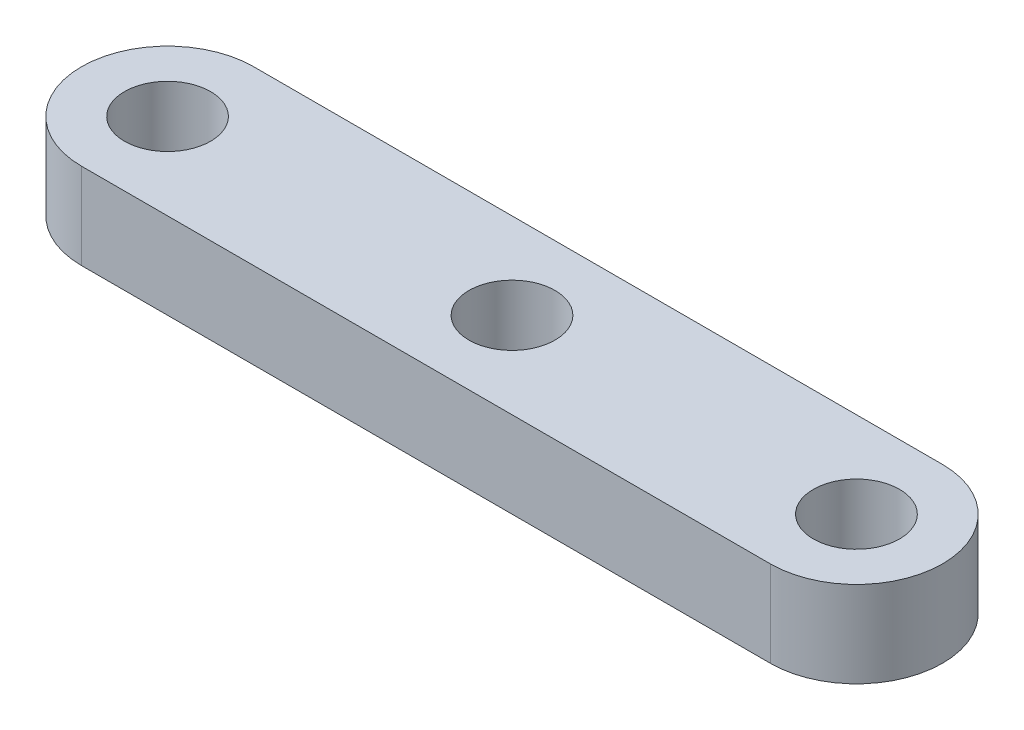
ISO-10303-21;
HEADER;
FILE_DESCRIPTION(('STEP AP214'),'2;1');
FILE_NAME('part.step','',(''),(''),'','','');
FILE_SCHEMA(('AUTOMOTIVE_DESIGN { 1 0 10303 214 1 1 1 1 }'));
ENDSEC;
DATA;
#1=APPLICATION_CONTEXT('core data for automotive mechanical design processes');
#2=APPLICATION_PROTOCOL_DEFINITION('international standard','automotive_design',2000,#1);
#3=PRODUCT_CONTEXT('',#1,'mechanical');
#4=PRODUCT('Part','Part','',(#3));
#5=PRODUCT_RELATED_PRODUCT_CATEGORY('part','',(#4));
#6=PRODUCT_DEFINITION_FORMATION('','',#4);
#7=PRODUCT_DEFINITION_CONTEXT('part definition',#1,'design');
#8=PRODUCT_DEFINITION('design','',#6,#7);
#9=PRODUCT_DEFINITION_SHAPE('','',#8);
#10=(LENGTH_UNIT() NAMED_UNIT(*) SI_UNIT(.MILLI.,.METRE.));
#11=(NAMED_UNIT(*) PLANE_ANGLE_UNIT() SI_UNIT($,.RADIAN.));
#12=(NAMED_UNIT(*) SI_UNIT($,.STERADIAN.) SOLID_ANGLE_UNIT());
#13=UNCERTAINTY_MEASURE_WITH_UNIT(LENGTH_MEASURE(1.E-05),#10,'distance_accuracy_value','');
#14=(GEOMETRIC_REPRESENTATION_CONTEXT(3) GLOBAL_UNCERTAINTY_ASSIGNED_CONTEXT((#13)) GLOBAL_UNIT_ASSIGNED_CONTEXT((#10,
#11,#12)) REPRESENTATION_CONTEXT('',''));
#15=CARTESIAN_POINT('',(0.,0.,0.));
#16=DIRECTION('',(0.,0.,1.));
#17=DIRECTION('',(1.,0.,0.));
#18=AXIS2_PLACEMENT_3D('',#15,#16,#17);
#19=CARTESIAN_POINT('',(20.,5.,0.));
#20=DIRECTION('',(0.,-1.,0.));
#21=DIRECTION('',(0.,0.,-1.));
#22=AXIS2_PLACEMENT_3D('',#19,#20,#21);
#23=CYLINDRICAL_SURFACE('',#22,5.);
#24=CARTESIAN_POINT('',(20.,0.,0.));
#25=DIRECTION('',(0.,1.,0.));
#26=DIRECTION('',(0.,0.,-1.));
#27=AXIS2_PLACEMENT_3D('',#24,#25,#26);
#28=CIRCLE('',#27,5.);
#29=CARTESIAN_POINT('',(20.,0.,5.));
#30=VERTEX_POINT('',#29);
#31=CARTESIAN_POINT('',(20.,0.,-5.));
#32=VERTEX_POINT('',#31);
#33=EDGE_CURVE('E96',#30,#32,#28,.T.);
#34=ORIENTED_EDGE('',*,*,#33,.T.);
#35=DIRECTION('',(0.,-1.,0.));
#36=VECTOR('',#35,1.);
#37=CARTESIAN_POINT('',(20.,5.,-5.));
#38=LINE('',#37,#36);
#39=CARTESIAN_POINT('',(20.,5.,-5.));
#40=VERTEX_POINT('',#39);
#41=EDGE_CURVE('E11',#40,#32,#38,.T.);
#42=ORIENTED_EDGE('',*,*,#41,.F.);
#43=CARTESIAN_POINT('',(20.,5.,0.));
#44=DIRECTION('',(0.,1.,0.));
#45=DIRECTION('',(0.,0.,-1.));
#46=AXIS2_PLACEMENT_3D('',#43,#44,#45);
#47=CIRCLE('',#46,5.);
#48=CARTESIAN_POINT('',(20.,5.,5.));
#49=VERTEX_POINT('',#48);
#50=EDGE_CURVE('E84',#49,#40,#47,.T.);
#51=ORIENTED_EDGE('',*,*,#50,.F.);
#52=DIRECTION('',(0.,-1.,0.));
#53=VECTOR('',#52,1.);
#54=CARTESIAN_POINT('',(20.,5.,5.));
#55=LINE('',#54,#53);
#56=EDGE_CURVE('E92',#49,#30,#55,.T.);
#57=ORIENTED_EDGE('',*,*,#56,.T.);
#58=EDGE_LOOP('',(#34,#42,#51,#57));
#59=FACE_BOUND('',#58,.T.);
#60=ADVANCED_FACE('F33',(#59),#23,.T.);
#61=CARTESIAN_POINT('',(-20.,5.,-5.));
#62=DIRECTION('',(0.,0.,1.));
#63=DIRECTION('',(1.,0.,0.));
#64=AXIS2_PLACEMENT_3D('',#61,#62,#63);
#65=PLANE('',#64);
#66=DIRECTION('',(-1.,0.,0.));
#67=VECTOR('',#66,1.);
#68=CARTESIAN_POINT('',(-20.,0.,-5.));
#69=LINE('',#68,#67);
#70=CARTESIAN_POINT('',(-20.,0.,-5.));
#71=VERTEX_POINT('',#70);
#72=EDGE_CURVE('E88',#32,#71,#69,.T.);
#73=ORIENTED_EDGE('',*,*,#72,.T.);
#74=DIRECTION('',(0.,-1.,0.));
#75=VECTOR('',#74,1.);
#76=CARTESIAN_POINT('',(-20.,5.,-5.));
#77=LINE('',#76,#75);
#78=CARTESIAN_POINT('',(-20.,5.,-5.));
#79=VERTEX_POINT('',#78);
#80=EDGE_CURVE('E41',#79,#71,#77,.T.);
#81=ORIENTED_EDGE('',*,*,#80,.F.);
#82=DIRECTION('',(-1.,0.,0.));
#83=VECTOR('',#82,1.);
#84=CARTESIAN_POINT('',(-20.,5.,-5.));
#85=LINE('',#84,#83);
#86=EDGE_CURVE('E79',#40,#79,#85,.T.);
#87=ORIENTED_EDGE('',*,*,#86,.F.);
#88=ORIENTED_EDGE('',*,*,#41,.T.);
#89=EDGE_LOOP('',(#73,#81,#87,#88));
#90=FACE_BOUND('',#89,.T.);
#91=ADVANCED_FACE('F87',(#90),#65,.F.);
#92=CARTESIAN_POINT('',(-20.,5.,0.));
#93=DIRECTION('',(0.,-1.,0.));
#94=DIRECTION('',(0.,0.,-1.));
#95=AXIS2_PLACEMENT_3D('',#92,#93,#94);
#96=CYLINDRICAL_SURFACE('',#95,5.);
#97=CARTESIAN_POINT('',(-20.,0.,0.));
#98=DIRECTION('',(0.,1.,0.));
#99=DIRECTION('',(0.,0.,1.));
#100=AXIS2_PLACEMENT_3D('',#97,#98,#99);
#101=CIRCLE('',#100,5.);
#102=CARTESIAN_POINT('',(-20.,0.,5.));
#103=VERTEX_POINT('',#102);
#104=EDGE_CURVE('E66',#71,#103,#101,.T.);
#105=ORIENTED_EDGE('',*,*,#104,.T.);
#106=DIRECTION('',(0.,-1.,0.));
#107=VECTOR('',#106,1.);
#108=CARTESIAN_POINT('',(-20.,5.,5.));
#109=LINE('',#108,#107);
#110=CARTESIAN_POINT('',(-20.,5.,5.));
#111=VERTEX_POINT('',#110);
#112=EDGE_CURVE('E89',#111,#103,#109,.T.);
#113=ORIENTED_EDGE('',*,*,#112,.F.);
#114=CARTESIAN_POINT('',(-20.,5.,0.));
#115=DIRECTION('',(0.,1.,0.));
#116=DIRECTION('',(0.,0.,1.));
#117=AXIS2_PLACEMENT_3D('',#114,#115,#116);
#118=CIRCLE('',#117,5.);
#119=EDGE_CURVE('E82',#79,#111,#118,.T.);
#120=ORIENTED_EDGE('',*,*,#119,.F.);
#121=ORIENTED_EDGE('',*,*,#80,.T.);
#122=EDGE_LOOP('',(#105,#113,#120,#121));
#123=FACE_BOUND('',#122,.T.);
#124=ADVANCED_FACE('F90',(#123),#96,.T.);
#125=CARTESIAN_POINT('',(-20.,5.,5.));
#126=DIRECTION('',(0.,0.,-1.));
#127=DIRECTION('',(-1.,0.,0.));
#128=AXIS2_PLACEMENT_3D('',#125,#126,#127);
#129=PLANE('',#128);
#130=DIRECTION('',(1.,0.,0.));
#131=VECTOR('',#130,1.);
#132=CARTESIAN_POINT('',(-20.,0.,5.));
#133=LINE('',#132,#131);
#134=EDGE_CURVE('E72',#103,#30,#133,.T.);
#135=ORIENTED_EDGE('',*,*,#134,.T.);
#136=ORIENTED_EDGE('',*,*,#56,.F.);
#137=DIRECTION('',(1.,0.,0.));
#138=VECTOR('',#137,1.);
#139=CARTESIAN_POINT('',(-20.,5.,5.));
#140=LINE('',#139,#138);
#141=EDGE_CURVE('E49',#111,#49,#140,.T.);
#142=ORIENTED_EDGE('',*,*,#141,.F.);
#143=ORIENTED_EDGE('',*,*,#112,.T.);
#144=EDGE_LOOP('',(#135,#136,#142,#143));
#145=FACE_BOUND('',#144,.T.);
#146=ADVANCED_FACE('F104',(#145),#129,.F.);
#147=CARTESIAN_POINT('',(20.,5.,0.));
#148=DIRECTION('',(0.,-1.,0.));
#149=DIRECTION('',(0.,0.,-1.));
#150=AXIS2_PLACEMENT_3D('',#147,#148,#149);
#151=PLANE('',#150);
#152=CARTESIAN_POINT('',(-20.,5.,0.));
#153=DIRECTION('',(0.,1.,0.));
#154=DIRECTION('',(0.,0.,1.));
#155=AXIS2_PLACEMENT_3D('',#152,#153,#154);
#156=CIRCLE('',#155,2.5);
#157=CARTESIAN_POINT('',(-20.,5.,2.5));
#158=VERTEX_POINT('',#157);
#159=EDGE_CURVE('E122',#158,#158,#156,.T.);
#160=ORIENTED_EDGE('',*,*,#159,.F.);
#161=EDGE_LOOP('',(#160));
#162=FACE_BOUND('',#161,.T.);
#163=CARTESIAN_POINT('',(20.,5.,0.));
#164=DIRECTION('',(0.,1.,0.));
#165=DIRECTION('',(0.,0.,1.));
#166=AXIS2_PLACEMENT_3D('',#163,#164,#165);
#167=CIRCLE('',#166,2.5);
#168=CARTESIAN_POINT('',(20.,5.,2.5));
#169=VERTEX_POINT('',#168);
#170=EDGE_CURVE('E116',#169,#169,#167,.T.);
#171=ORIENTED_EDGE('',*,*,#170,.F.);
#172=EDGE_LOOP('',(#171));
#173=FACE_BOUND('',#172,.T.);
#174=CARTESIAN_POINT('',(0.,5.,0.));
#175=DIRECTION('',(0.,1.,0.));
#176=DIRECTION('',(0.,0.,1.));
#177=AXIS2_PLACEMENT_3D('',#174,#175,#176);
#178=CIRCLE('',#177,2.5);
#179=CARTESIAN_POINT('',(0.,5.,2.5));
#180=VERTEX_POINT('',#179);
#181=EDGE_CURVE('E110',#180,#180,#178,.T.);
#182=ORIENTED_EDGE('',*,*,#181,.F.);
#183=EDGE_LOOP('',(#182));
#184=FACE_BOUND('',#183,.T.);
#185=ORIENTED_EDGE('',*,*,#50,.T.);
#186=ORIENTED_EDGE('',*,*,#86,.T.);
#187=ORIENTED_EDGE('',*,*,#119,.T.);
#188=ORIENTED_EDGE('',*,*,#141,.T.);
#189=EDGE_LOOP('',(#185,#186,#187,#188));
#190=FACE_BOUND('',#189,.T.);
#191=ADVANCED_FACE('F80',(#162,#173,#184,#190),#151,.F.);
#192=CARTESIAN_POINT('',(20.,0.,0.));
#193=DIRECTION('',(0.,-1.,0.));
#194=DIRECTION('',(0.,0.,-1.));
#195=AXIS2_PLACEMENT_3D('',#192,#193,#194);
#196=PLANE('',#195);
#197=CARTESIAN_POINT('',(-20.,0.,0.));
#198=DIRECTION('',(0.,1.,0.));
#199=DIRECTION('',(0.,0.,1.));
#200=AXIS2_PLACEMENT_3D('',#197,#198,#199);
#201=CIRCLE('',#200,2.5);
#202=CARTESIAN_POINT('',(-20.,0.,2.5));
#203=VERTEX_POINT('',#202);
#204=EDGE_CURVE('E99',#203,#203,#201,.T.);
#205=ORIENTED_EDGE('',*,*,#204,.T.);
#206=EDGE_LOOP('',(#205));
#207=FACE_BOUND('',#206,.T.);
#208=CARTESIAN_POINT('',(20.,0.,0.));
#209=DIRECTION('',(0.,1.,0.));
#210=DIRECTION('',(0.,0.,1.));
#211=AXIS2_PLACEMENT_3D('',#208,#209,#210);
#212=CIRCLE('',#211,2.5);
#213=CARTESIAN_POINT('',(20.,0.,2.5));
#214=VERTEX_POINT('',#213);
#215=EDGE_CURVE('E119',#214,#214,#212,.T.);
#216=ORIENTED_EDGE('',*,*,#215,.T.);
#217=EDGE_LOOP('',(#216));
#218=FACE_BOUND('',#217,.T.);
#219=CARTESIAN_POINT('',(0.,0.,0.));
#220=DIRECTION('',(0.,1.,0.));
#221=DIRECTION('',(0.,0.,1.));
#222=AXIS2_PLACEMENT_3D('',#219,#220,#221);
#223=CIRCLE('',#222,2.5);
#224=CARTESIAN_POINT('',(0.,0.,2.5));
#225=VERTEX_POINT('',#224);
#226=EDGE_CURVE('E113',#225,#225,#223,.T.);
#227=ORIENTED_EDGE('',*,*,#226,.T.);
#228=EDGE_LOOP('',(#227));
#229=FACE_BOUND('',#228,.T.);
#230=ORIENTED_EDGE('',*,*,#33,.F.);
#231=ORIENTED_EDGE('',*,*,#134,.F.);
#232=ORIENTED_EDGE('',*,*,#104,.F.);
#233=ORIENTED_EDGE('',*,*,#72,.F.);
#234=EDGE_LOOP('',(#230,#231,#232,#233));
#235=FACE_BOUND('',#234,.T.);
#236=ADVANCED_FACE('F107',(#207,#218,#229,#235),#196,.T.);
#237=CARTESIAN_POINT('',(0.,0.,0.));
#238=DIRECTION('',(0.,1.,0.));
#239=DIRECTION('',(0.,0.,1.));
#240=AXIS2_PLACEMENT_3D('',#237,#238,#239);
#241=CYLINDRICAL_SURFACE('',#240,2.5);
#242=ORIENTED_EDGE('',*,*,#226,.F.);
#243=EDGE_LOOP('',(#242));
#244=FACE_BOUND('',#243,.T.);
#245=ORIENTED_EDGE('',*,*,#181,.T.);
#246=EDGE_LOOP('',(#245));
#247=FACE_BOUND('',#246,.T.);
#248=ADVANCED_FACE('F144',(#244,#247),#241,.F.);
#249=CARTESIAN_POINT('',(20.,0.,0.));
#250=DIRECTION('',(0.,1.,0.));
#251=DIRECTION('',(0.,0.,1.));
#252=AXIS2_PLACEMENT_3D('',#249,#250,#251);
#253=CYLINDRICAL_SURFACE('',#252,2.5);
#254=ORIENTED_EDGE('',*,*,#215,.F.);
#255=EDGE_LOOP('',(#254));
#256=FACE_BOUND('',#255,.T.);
#257=ORIENTED_EDGE('',*,*,#170,.T.);
#258=EDGE_LOOP('',(#257));
#259=FACE_BOUND('',#258,.T.);
#260=ADVANCED_FACE('F133',(#256,#259),#253,.F.);
#261=CARTESIAN_POINT('',(-20.,0.,0.));
#262=DIRECTION('',(0.,1.,0.));
#263=DIRECTION('',(0.,0.,1.));
#264=AXIS2_PLACEMENT_3D('',#261,#262,#263);
#265=CYLINDRICAL_SURFACE('',#264,2.5);
#266=ORIENTED_EDGE('',*,*,#204,.F.);
#267=EDGE_LOOP('',(#266));
#268=FACE_BOUND('',#267,.T.);
#269=ORIENTED_EDGE('',*,*,#159,.T.);
#270=EDGE_LOOP('',(#269));
#271=FACE_BOUND('',#270,.T.);
#272=ADVANCED_FACE('F130',(#268,#271),#265,.F.);
#273=CLOSED_SHELL('',(#60,#91,#124,#146,#191,#236,#248,#260,#272));
#274=MANIFOLD_SOLID_BREP('B2',#273);
#275=ADVANCED_BREP_SHAPE_REPRESENTATION('',(#18,#274),#14);
#276=SHAPE_DEFINITION_REPRESENTATION(#9,#275);
ENDSEC;
END-ISO-10303-21;
